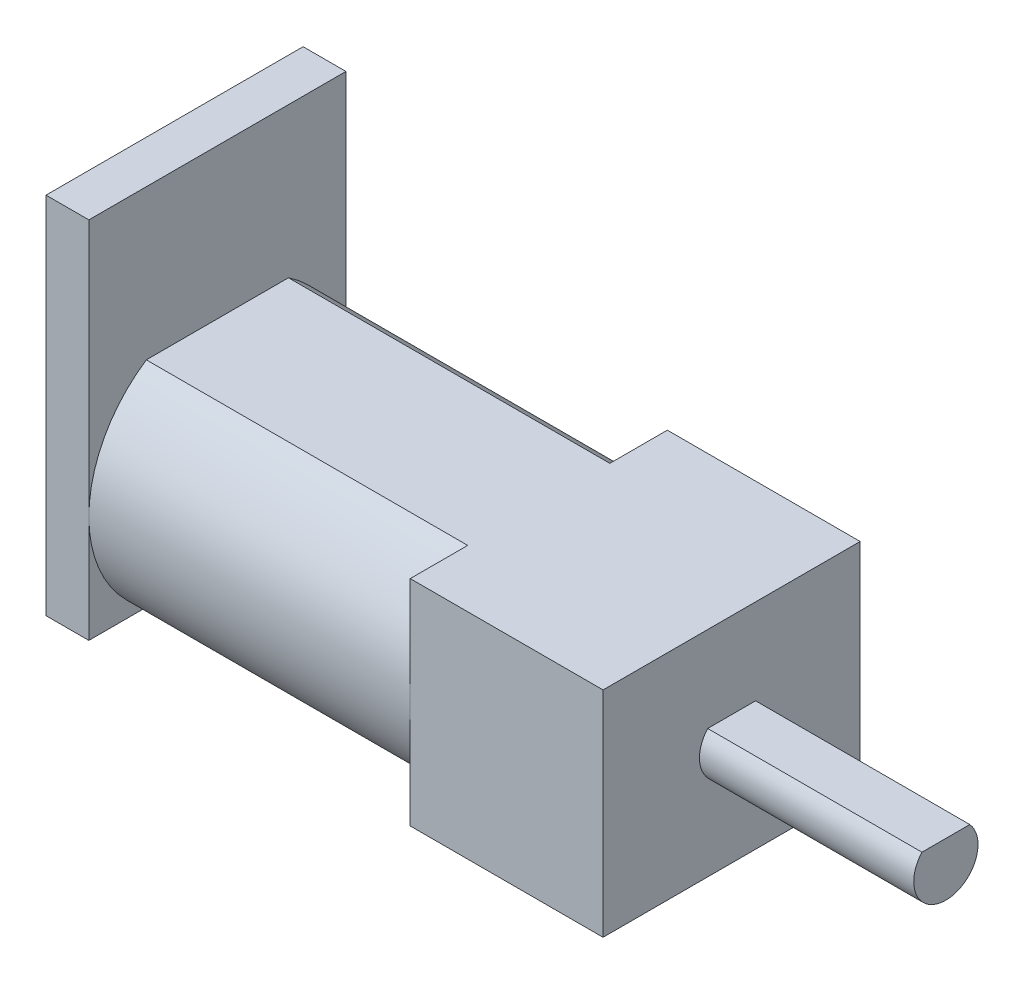
ISO-10303-21;
HEADER;
FILE_DESCRIPTION(('STEP AP214'),'2;1');
FILE_NAME('part.step','',(''),(''),'','','');
FILE_SCHEMA(('AUTOMOTIVE_DESIGN { 1 0 10303 214 1 1 1 1 }'));
ENDSEC;
DATA;
#1=APPLICATION_CONTEXT('core data for automotive mechanical design processes');
#2=APPLICATION_PROTOCOL_DEFINITION('international standard','automotive_design',2000,#1);
#3=PRODUCT_CONTEXT('',#1,'mechanical');
#4=PRODUCT('Part','Part','',(#3));
#5=PRODUCT_RELATED_PRODUCT_CATEGORY('part','',(#4));
#6=PRODUCT_DEFINITION_FORMATION('','',#4);
#7=PRODUCT_DEFINITION_CONTEXT('part definition',#1,'design');
#8=PRODUCT_DEFINITION('design','',#6,#7);
#9=PRODUCT_DEFINITION_SHAPE('','',#8);
#10=(LENGTH_UNIT() NAMED_UNIT(*) SI_UNIT(.MILLI.,.METRE.));
#11=(NAMED_UNIT(*) PLANE_ANGLE_UNIT() SI_UNIT($,.RADIAN.));
#12=(NAMED_UNIT(*) SI_UNIT($,.STERADIAN.) SOLID_ANGLE_UNIT());
#13=UNCERTAINTY_MEASURE_WITH_UNIT(LENGTH_MEASURE(1.E-05),#10,'distance_accuracy_value','');
#14=(GEOMETRIC_REPRESENTATION_CONTEXT(3) GLOBAL_UNCERTAINTY_ASSIGNED_CONTEXT((#13)) GLOBAL_UNIT_ASSIGNED_CONTEXT((#10,
#11,#12)) REPRESENTATION_CONTEXT('',''));
#15=CARTESIAN_POINT('',(0.,0.,0.));
#16=DIRECTION('',(0.,0.,1.));
#17=DIRECTION('',(1.,0.,0.));
#18=AXIS2_PLACEMENT_3D('',#15,#16,#17);
#19=CARTESIAN_POINT('',(24.,0.,0.));
#20=DIRECTION('',(1.,0.,0.));
#21=DIRECTION('',(0.,0.,-1.));
#22=AXIS2_PLACEMENT_3D('',#19,#20,#21);
#23=PLANE('',#22);
#24=DIRECTION('',(0.,0.,-1.));
#25=VECTOR('',#24,1.);
#26=CARTESIAN_POINT('',(24.,10.,0.));
#27=LINE('',#26,#25);
#28=CARTESIAN_POINT('',(24.,10.,0.));
#29=VERTEX_POINT('',#28);
#30=CARTESIAN_POINT('',(24.,10.,-12.));
#31=VERTEX_POINT('',#30);
#32=EDGE_CURVE('E234',#29,#31,#27,.T.);
#33=ORIENTED_EDGE('',*,*,#32,.F.);
#34=DIRECTION('',(0.,1.,0.));
#35=VECTOR('',#34,1.);
#36=CARTESIAN_POINT('',(24.,0.,0.));
#37=LINE('',#36,#35);
#38=CARTESIAN_POINT('',(24.,0.,0.));
#39=VERTEX_POINT('',#38);
#40=EDGE_CURVE('E237',#39,#29,#37,.T.);
#41=ORIENTED_EDGE('',*,*,#40,.F.);
#42=DIRECTION('',(0.,0.,-1.));
#43=VECTOR('',#42,1.);
#44=CARTESIAN_POINT('',(24.,0.,0.));
#45=LINE('',#44,#43);
#46=CARTESIAN_POINT('',(24.,0.,-12.));
#47=VERTEX_POINT('',#46);
#48=EDGE_CURVE('E240',#39,#47,#45,.T.);
#49=ORIENTED_EDGE('',*,*,#48,.T.);
#50=DIRECTION('',(0.,1.,0.));
#51=VECTOR('',#50,1.);
#52=CARTESIAN_POINT('',(24.,0.,-12.));
#53=LINE('',#52,#51);
#54=EDGE_CURVE('E243',#47,#31,#53,.T.);
#55=ORIENTED_EDGE('',*,*,#54,.T.);
#56=EDGE_LOOP('',(#33,#41,#49,#55));
#57=FACE_BOUND('',#56,.T.);
#58=DIRECTION('',(0.,0.,1.));
#59=VECTOR('',#58,1.);
#60=CARTESIAN_POINT('',(24.,6.,0.));
#61=LINE('',#60,#59);
#62=CARTESIAN_POINT('',(24.,6.,-7.1180339887499));
#63=VERTEX_POINT('',#62);
#64=CARTESIAN_POINT('',(24.,6.,-4.88196601125011));
#65=VERTEX_POINT('',#64);
#66=EDGE_CURVE('E11',#63,#65,#61,.T.);
#67=ORIENTED_EDGE('',*,*,#66,.F.);
#68=CARTESIAN_POINT('',(24.,5.,-6.));
#69=DIRECTION('',(1.,0.,0.));
#70=DIRECTION('',(0.,0.,-1.));
#71=AXIS2_PLACEMENT_3D('',#68,#69,#70);
#72=CIRCLE('',#71,1.5);
#73=EDGE_CURVE('E51',#63,#65,#72,.F.);
#74=ORIENTED_EDGE('',*,*,#73,.T.);
#75=EDGE_LOOP('',(#67,#74));
#76=FACE_BOUND('',#75,.T.);
#77=ADVANCED_FACE('F43',(#57,#76),#23,.T.);
#78=CARTESIAN_POINT('',(-2.,0.,-12.));
#79=DIRECTION('',(0.,0.,-1.));
#80=DIRECTION('',(-1.,0.,0.));
#81=AXIS2_PLACEMENT_3D('',#78,#79,#80);
#82=PLANE('',#81);
#83=DIRECTION('',(0.,1.,0.));
#84=VECTOR('',#83,1.);
#85=CARTESIAN_POINT('',(0.,0.,-12.));
#86=LINE('',#85,#84);
#87=CARTESIAN_POINT('',(0.,5.,-12.));
#88=VERTEX_POINT('',#87);
#89=CARTESIAN_POINT('',(0.,17.,-12.));
#90=VERTEX_POINT('',#89);
#91=EDGE_CURVE('E252',#88,#90,#86,.T.);
#92=ORIENTED_EDGE('',*,*,#91,.F.);
#93=DIRECTION('',(0.,1.,0.));
#94=VECTOR('',#93,1.);
#95=CARTESIAN_POINT('',(0.,0.,-12.));
#96=LINE('',#95,#94);
#97=CARTESIAN_POINT('',(0.,0.,-12.));
#98=VERTEX_POINT('',#97);
#99=EDGE_CURVE('E177',#98,#88,#96,.T.);
#100=ORIENTED_EDGE('',*,*,#99,.F.);
#101=DIRECTION('',(1.,0.,0.));
#102=VECTOR('',#101,1.);
#103=CARTESIAN_POINT('',(-2.,0.,-12.));
#104=LINE('',#103,#102);
#105=CARTESIAN_POINT('',(-2.,0.,-12.));
#106=VERTEX_POINT('',#105);
#107=EDGE_CURVE('E280',#106,#98,#104,.T.);
#108=ORIENTED_EDGE('',*,*,#107,.F.);
#109=DIRECTION('',(0.,1.,0.));
#110=VECTOR('',#109,1.);
#111=CARTESIAN_POINT('',(-2.,0.,-12.));
#112=LINE('',#111,#110);
#113=CARTESIAN_POINT('',(-2.,17.,-12.));
#114=VERTEX_POINT('',#113);
#115=EDGE_CURVE('E256',#106,#114,#112,.T.);
#116=ORIENTED_EDGE('',*,*,#115,.T.);
#117=DIRECTION('',(1.,0.,0.));
#118=VECTOR('',#117,1.);
#119=CARTESIAN_POINT('',(-2.,17.,-12.));
#120=LINE('',#119,#118);
#121=EDGE_CURVE('E277',#114,#90,#120,.T.);
#122=ORIENTED_EDGE('',*,*,#121,.T.);
#123=EDGE_LOOP('',(#92,#100,#108,#116,#122));
#124=FACE_BOUND('',#123,.T.);
#125=ADVANCED_FACE('F284',(#124),#82,.T.);
#126=CARTESIAN_POINT('',(-2.,0.,0.));
#127=DIRECTION('',(0.,0.,-1.));
#128=DIRECTION('',(-1.,0.,0.));
#129=AXIS2_PLACEMENT_3D('',#126,#127,#128);
#130=PLANE('',#129);
#131=DIRECTION('',(0.,1.,0.));
#132=VECTOR('',#131,1.);
#133=CARTESIAN_POINT('',(0.,0.,0.));
#134=LINE('',#133,#132);
#135=CARTESIAN_POINT('',(0.,0.,0.));
#136=VERTEX_POINT('',#135);
#137=CARTESIAN_POINT('',(0.,5.,0.));
#138=VERTEX_POINT('',#137);
#139=EDGE_CURVE('E203',#136,#138,#134,.T.);
#140=ORIENTED_EDGE('',*,*,#139,.T.);
#141=DIRECTION('',(0.,1.,0.));
#142=VECTOR('',#141,1.);
#143=CARTESIAN_POINT('',(0.,0.,0.));
#144=LINE('',#143,#142);
#145=CARTESIAN_POINT('',(0.,17.,0.));
#146=VERTEX_POINT('',#145);
#147=EDGE_CURVE('E257',#138,#146,#144,.T.);
#148=ORIENTED_EDGE('',*,*,#147,.T.);
#149=DIRECTION('',(1.,0.,0.));
#150=VECTOR('',#149,1.);
#151=CARTESIAN_POINT('',(-2.,17.,0.));
#152=LINE('',#151,#150);
#153=CARTESIAN_POINT('',(-2.,17.,0.));
#154=VERTEX_POINT('',#153);
#155=EDGE_CURVE('E274',#154,#146,#152,.T.);
#156=ORIENTED_EDGE('',*,*,#155,.F.);
#157=DIRECTION('',(0.,1.,0.));
#158=VECTOR('',#157,1.);
#159=CARTESIAN_POINT('',(-2.,0.,0.));
#160=LINE('',#159,#158);
#161=CARTESIAN_POINT('',(-2.,0.,0.));
#162=VERTEX_POINT('',#161);
#163=EDGE_CURVE('E262',#162,#154,#160,.T.);
#164=ORIENTED_EDGE('',*,*,#163,.F.);
#165=DIRECTION('',(1.,0.,0.));
#166=VECTOR('',#165,1.);
#167=CARTESIAN_POINT('',(-2.,0.,0.));
#168=LINE('',#167,#166);
#169=EDGE_CURVE('E270',#162,#136,#168,.T.);
#170=ORIENTED_EDGE('',*,*,#169,.T.);
#171=EDGE_LOOP('',(#140,#148,#156,#164,#170));
#172=FACE_BOUND('',#171,.T.);
#173=ADVANCED_FACE('F292',(#172),#130,.F.);
#174=CARTESIAN_POINT('',(0.,0.,0.));
#175=DIRECTION('',(1.,0.,0.));
#176=DIRECTION('',(0.,0.,-1.));
#177=AXIS2_PLACEMENT_3D('',#174,#175,#176);
#178=PLANE('',#177);
#179=ORIENTED_EDGE('',*,*,#147,.F.);
#180=CARTESIAN_POINT('',(0.,5.,-6.));
#181=DIRECTION('',(1.,0.,0.));
#182=DIRECTION('',(0.,0.,-1.));
#183=AXIS2_PLACEMENT_3D('',#180,#181,#182);
#184=CIRCLE('',#183,6.);
#185=CARTESIAN_POINT('',(0.,10.,-2.6833752096446));
#186=VERTEX_POINT('',#185);
#187=EDGE_CURVE('E65',#186,#138,#184,.T.);
#188=ORIENTED_EDGE('',*,*,#187,.F.);
#189=DIRECTION('',(0.,0.,-1.));
#190=VECTOR('',#189,1.);
#191=CARTESIAN_POINT('',(0.,10.,0.));
#192=LINE('',#191,#190);
#193=CARTESIAN_POINT('',(0.,10.,-9.31662479035541));
#194=VERTEX_POINT('',#193);
#195=EDGE_CURVE('E223',#186,#194,#192,.T.);
#196=ORIENTED_EDGE('',*,*,#195,.T.);
#197=CARTESIAN_POINT('',(0.,5.,-6.));
#198=DIRECTION('',(1.,0.,0.));
#199=DIRECTION('',(0.,0.,-1.));
#200=AXIS2_PLACEMENT_3D('',#197,#198,#199);
#201=CIRCLE('',#200,6.);
#202=EDGE_CURVE('E213',#88,#194,#201,.T.);
#203=ORIENTED_EDGE('',*,*,#202,.F.);
#204=ORIENTED_EDGE('',*,*,#91,.T.);
#205=DIRECTION('',(0.,0.,-1.));
#206=VECTOR('',#205,1.);
#207=CARTESIAN_POINT('',(0.,17.,0.));
#208=LINE('',#207,#206);
#209=EDGE_CURVE('E266',#146,#90,#208,.T.);
#210=ORIENTED_EDGE('',*,*,#209,.F.);
#211=EDGE_LOOP('',(#179,#188,#196,#203,#204,#210));
#212=FACE_BOUND('',#211,.T.);
#213=ADVANCED_FACE('F308',(#212),#178,.T.);
#214=CARTESIAN_POINT('',(-2.,0.,0.));
#215=DIRECTION('',(0.,-1.,0.));
#216=DIRECTION('',(0.,0.,-1.));
#217=AXIS2_PLACEMENT_3D('',#214,#215,#216);
#218=PLANE('',#217);
#219=DIRECTION('',(0.,0.,-1.));
#220=VECTOR('',#219,1.);
#221=CARTESIAN_POINT('',(15.,0.,0.));
#222=LINE('',#221,#220);
#223=CARTESIAN_POINT('',(15.,0.,-9.3166247903554));
#224=VERTEX_POINT('',#223);
#225=CARTESIAN_POINT('',(15.,0.,-12.));
#226=VERTEX_POINT('',#225);
#227=EDGE_CURVE('E176',#224,#226,#222,.T.);
#228=ORIENTED_EDGE('',*,*,#227,.T.);
#229=EDGE_CURVE('E264',#226,#47,#104,.T.);
#230=ORIENTED_EDGE('',*,*,#229,.T.);
#231=ORIENTED_EDGE('',*,*,#48,.F.);
#232=CARTESIAN_POINT('',(15.,0.,0.));
#233=VERTEX_POINT('',#232);
#234=EDGE_CURVE('E273',#233,#39,#168,.T.);
#235=ORIENTED_EDGE('',*,*,#234,.F.);
#236=DIRECTION('',(0.,0.,-1.));
#237=VECTOR('',#236,1.);
#238=CARTESIAN_POINT('',(15.,0.,0.));
#239=LINE('',#238,#237);
#240=CARTESIAN_POINT('',(15.,0.,-2.68337520964461));
#241=VERTEX_POINT('',#240);
#242=EDGE_CURVE('E197',#233,#241,#239,.T.);
#243=ORIENTED_EDGE('',*,*,#242,.T.);
#244=DIRECTION('',(-1.,0.,0.));
#245=VECTOR('',#244,1.);
#246=CARTESIAN_POINT('',(15.,0.,-2.68337520964461));
#247=LINE('',#246,#245);
#248=CARTESIAN_POINT('',(0.,0.,-2.68337520964461));
#249=VERTEX_POINT('',#248);
#250=EDGE_CURVE('E200',#241,#249,#247,.T.);
#251=ORIENTED_EDGE('',*,*,#250,.T.);
#252=DIRECTION('',(0.,0.,-1.));
#253=VECTOR('',#252,1.);
#254=CARTESIAN_POINT('',(0.,0.,0.));
#255=LINE('',#254,#253);
#256=EDGE_CURVE('E195',#136,#249,#255,.T.);
#257=ORIENTED_EDGE('',*,*,#256,.F.);
#258=ORIENTED_EDGE('',*,*,#169,.F.);
#259=DIRECTION('',(0.,0.,-1.));
#260=VECTOR('',#259,1.);
#261=CARTESIAN_POINT('',(-2.,0.,0.));
#262=LINE('',#261,#260);
#263=EDGE_CURVE('E253',#162,#106,#262,.T.);
#264=ORIENTED_EDGE('',*,*,#263,.T.);
#265=ORIENTED_EDGE('',*,*,#107,.T.);
#266=DIRECTION('',(0.,0.,-1.));
#267=VECTOR('',#266,1.);
#268=CARTESIAN_POINT('',(0.,0.,0.));
#269=LINE('',#268,#267);
#270=CARTESIAN_POINT('',(0.,0.,-9.3166247903554));
#271=VERTEX_POINT('',#270);
#272=EDGE_CURVE('E185',#271,#98,#269,.T.);
#273=ORIENTED_EDGE('',*,*,#272,.F.);
#274=DIRECTION('',(-1.,0.,0.));
#275=VECTOR('',#274,1.);
#276=CARTESIAN_POINT('',(15.,0.,-9.3166247903554));
#277=LINE('',#276,#275);
#278=EDGE_CURVE('E183',#224,#271,#277,.T.);
#279=ORIENTED_EDGE('',*,*,#278,.F.);
#280=EDGE_LOOP('',(#228,#230,#231,#235,#243,#251,#257,#258,#264,#265,#273,#279));
#281=FACE_BOUND('',#280,.T.);
#282=ADVANCED_FACE('F45',(#281),#218,.T.);
#283=DIRECTION('',(0.,1.,0.));
#284=VECTOR('',#283,1.);
#285=CARTESIAN_POINT('',(15.,0.,0.));
#286=LINE('',#285,#284);
#287=CARTESIAN_POINT('',(15.,5.,0.));
#288=VERTEX_POINT('',#287);
#289=CARTESIAN_POINT('',(15.,10.,0.));
#290=VERTEX_POINT('',#289);
#291=EDGE_CURVE('E230',#288,#290,#286,.T.);
#292=ORIENTED_EDGE('',*,*,#291,.F.);
#293=DIRECTION('',(0.,1.,0.));
#294=VECTOR('',#293,1.);
#295=CARTESIAN_POINT('',(15.,0.,0.));
#296=LINE('',#295,#294);
#297=EDGE_CURVE('E194',#233,#288,#296,.T.);
#298=ORIENTED_EDGE('',*,*,#297,.F.);
#299=ORIENTED_EDGE('',*,*,#234,.T.);
#300=ORIENTED_EDGE('',*,*,#40,.T.);
#301=DIRECTION('',(-1.,0.,0.));
#302=VECTOR('',#301,1.);
#303=CARTESIAN_POINT('',(24.,10.,0.));
#304=LINE('',#303,#302);
#305=EDGE_CURVE('E249',#29,#290,#304,.T.);
#306=ORIENTED_EDGE('',*,*,#305,.T.);
#307=EDGE_LOOP('',(#292,#298,#299,#300,#306));
#308=FACE_BOUND('',#307,.T.);
#309=ADVANCED_FACE('F311',(#308),#130,.F.);
#310=CARTESIAN_POINT('',(-2.,17.,0.));
#311=DIRECTION('',(0.,-1.,0.));
#312=DIRECTION('',(0.,0.,-1.));
#313=AXIS2_PLACEMENT_3D('',#310,#311,#312);
#314=PLANE('',#313);
#315=ORIENTED_EDGE('',*,*,#209,.T.);
#316=ORIENTED_EDGE('',*,*,#121,.F.);
#317=DIRECTION('',(0.,0.,-1.));
#318=VECTOR('',#317,1.);
#319=CARTESIAN_POINT('',(-2.,17.,0.));
#320=LINE('',#319,#318);
#321=EDGE_CURVE('E260',#154,#114,#320,.T.);
#322=ORIENTED_EDGE('',*,*,#321,.F.);
#323=ORIENTED_EDGE('',*,*,#155,.T.);
#324=EDGE_LOOP('',(#315,#316,#322,#323));
#325=FACE_BOUND('',#324,.T.);
#326=ADVANCED_FACE('F314',(#325),#314,.F.);
#327=DIRECTION('',(0.,1.,0.));
#328=VECTOR('',#327,1.);
#329=CARTESIAN_POINT('',(15.,0.,-12.));
#330=LINE('',#329,#328);
#331=CARTESIAN_POINT('',(15.,5.,-12.));
#332=VERTEX_POINT('',#331);
#333=EDGE_CURVE('E180',#226,#332,#330,.T.);
#334=ORIENTED_EDGE('',*,*,#333,.T.);
#335=DIRECTION('',(0.,1.,0.));
#336=VECTOR('',#335,1.);
#337=CARTESIAN_POINT('',(15.,0.,-12.));
#338=LINE('',#337,#336);
#339=CARTESIAN_POINT('',(15.,10.,-12.));
#340=VERTEX_POINT('',#339);
#341=EDGE_CURVE('E212',#332,#340,#338,.T.);
#342=ORIENTED_EDGE('',*,*,#341,.T.);
#343=DIRECTION('',(-1.,0.,0.));
#344=VECTOR('',#343,1.);
#345=CARTESIAN_POINT('',(24.,10.,-12.));
#346=LINE('',#345,#344);
#347=EDGE_CURVE('E245',#31,#340,#346,.T.);
#348=ORIENTED_EDGE('',*,*,#347,.F.);
#349=ORIENTED_EDGE('',*,*,#54,.F.);
#350=ORIENTED_EDGE('',*,*,#229,.F.);
#351=EDGE_LOOP('',(#334,#342,#348,#349,#350));
#352=FACE_BOUND('',#351,.T.);
#353=ADVANCED_FACE('F294',(#352),#82,.T.);
#354=CARTESIAN_POINT('',(-2.,0.,0.));
#355=DIRECTION('',(1.,0.,0.));
#356=DIRECTION('',(0.,0.,-1.));
#357=AXIS2_PLACEMENT_3D('',#354,#355,#356);
#358=PLANE('',#357);
#359=ORIENTED_EDGE('',*,*,#263,.F.);
#360=ORIENTED_EDGE('',*,*,#163,.T.);
#361=ORIENTED_EDGE('',*,*,#321,.T.);
#362=ORIENTED_EDGE('',*,*,#115,.F.);
#363=EDGE_LOOP('',(#359,#360,#361,#362));
#364=FACE_BOUND('',#363,.T.);
#365=ADVANCED_FACE('F303',(#364),#358,.F.);
#366=CARTESIAN_POINT('',(24.,10.,0.));
#367=DIRECTION('',(0.,1.,0.));
#368=DIRECTION('',(0.,0.,1.));
#369=AXIS2_PLACEMENT_3D('',#366,#367,#368);
#370=PLANE('',#369);
#371=DIRECTION('',(-1.,0.,0.));
#372=VECTOR('',#371,1.);
#373=CARTESIAN_POINT('',(15.,10.,-9.31662479035541));
#374=LINE('',#373,#372);
#375=CARTESIAN_POINT('',(15.,10.,-9.31662479035541));
#376=VERTEX_POINT('',#375);
#377=EDGE_CURVE('E218',#376,#194,#374,.T.);
#378=ORIENTED_EDGE('',*,*,#377,.T.);
#379=ORIENTED_EDGE('',*,*,#195,.F.);
#380=DIRECTION('',(-1.,0.,0.));
#381=VECTOR('',#380,1.);
#382=CARTESIAN_POINT('',(15.,10.,-2.6833752096446));
#383=LINE('',#382,#381);
#384=CARTESIAN_POINT('',(15.,10.,-2.6833752096446));
#385=VERTEX_POINT('',#384);
#386=EDGE_CURVE('E220',#385,#186,#383,.T.);
#387=ORIENTED_EDGE('',*,*,#386,.F.);
#388=DIRECTION('',(0.,0.,-1.));
#389=VECTOR('',#388,1.);
#390=CARTESIAN_POINT('',(15.,10.,0.));
#391=LINE('',#390,#389);
#392=EDGE_CURVE('E227',#290,#385,#391,.T.);
#393=ORIENTED_EDGE('',*,*,#392,.F.);
#394=ORIENTED_EDGE('',*,*,#305,.F.);
#395=ORIENTED_EDGE('',*,*,#32,.T.);
#396=ORIENTED_EDGE('',*,*,#347,.T.);
#397=DIRECTION('',(0.,0.,-1.));
#398=VECTOR('',#397,1.);
#399=CARTESIAN_POINT('',(15.,10.,0.));
#400=LINE('',#399,#398);
#401=EDGE_CURVE('E216',#376,#340,#400,.T.);
#402=ORIENTED_EDGE('',*,*,#401,.F.);
#403=EDGE_LOOP('',(#378,#379,#387,#393,#394,#395,#396,#402));
#404=FACE_BOUND('',#403,.T.);
#405=ADVANCED_FACE('F300',(#404),#370,.T.);
#406=CARTESIAN_POINT('',(15.,5.,-6.));
#407=DIRECTION('',(-1.,0.,0.));
#408=DIRECTION('',(0.,0.,1.));
#409=AXIS2_PLACEMENT_3D('',#406,#407,#408);
#410=CYLINDRICAL_SURFACE('',#409,6.);
#411=ORIENTED_EDGE('',*,*,#187,.T.);
#412=CARTESIAN_POINT('',(0.,5.,-6.));
#413=DIRECTION('',(1.,0.,0.));
#414=DIRECTION('',(0.,0.,-1.));
#415=AXIS2_PLACEMENT_3D('',#412,#413,#414);
#416=CIRCLE('',#415,6.);
#417=EDGE_CURVE('E190',#138,#249,#416,.T.);
#418=ORIENTED_EDGE('',*,*,#417,.T.);
#419=ORIENTED_EDGE('',*,*,#250,.F.);
#420=CARTESIAN_POINT('',(15.,5.,-6.));
#421=DIRECTION('',(1.,0.,0.));
#422=DIRECTION('',(0.,0.,-1.));
#423=AXIS2_PLACEMENT_3D('',#420,#421,#422);
#424=CIRCLE('',#423,6.);
#425=EDGE_CURVE('E191',#288,#241,#424,.T.);
#426=ORIENTED_EDGE('',*,*,#425,.F.);
#427=CARTESIAN_POINT('',(15.,5.,-6.));
#428=DIRECTION('',(1.,0.,0.));
#429=DIRECTION('',(0.,0.,-1.));
#430=AXIS2_PLACEMENT_3D('',#427,#428,#429);
#431=CIRCLE('',#430,6.);
#432=EDGE_CURVE('E224',#385,#288,#431,.T.);
#433=ORIENTED_EDGE('',*,*,#432,.F.);
#434=ORIENTED_EDGE('',*,*,#386,.T.);
#435=EDGE_LOOP('',(#411,#418,#419,#426,#433,#434));
#436=FACE_BOUND('',#435,.T.);
#437=ADVANCED_FACE('F298',(#436),#410,.T.);
#438=CARTESIAN_POINT('',(15.,0.,0.));
#439=DIRECTION('',(1.,0.,0.));
#440=DIRECTION('',(0.,0.,-1.));
#441=AXIS2_PLACEMENT_3D('',#438,#439,#440);
#442=PLANE('',#441);
#443=ORIENTED_EDGE('',*,*,#432,.T.);
#444=ORIENTED_EDGE('',*,*,#291,.T.);
#445=ORIENTED_EDGE('',*,*,#392,.T.);
#446=EDGE_LOOP('',(#443,#444,#445));
#447=FACE_BOUND('',#446,.T.);
#448=ADVANCED_FACE('F385',(#447),#442,.F.);
#449=CARTESIAN_POINT('',(15.,5.,-6.));
#450=DIRECTION('',(-1.,0.,0.));
#451=DIRECTION('',(0.,0.,1.));
#452=AXIS2_PLACEMENT_3D('',#449,#450,#451);
#453=CYLINDRICAL_SURFACE('',#452,6.);
#454=ORIENTED_EDGE('',*,*,#202,.T.);
#455=ORIENTED_EDGE('',*,*,#377,.F.);
#456=CARTESIAN_POINT('',(15.,5.,-6.));
#457=DIRECTION('',(1.,0.,0.));
#458=DIRECTION('',(0.,0.,-1.));
#459=AXIS2_PLACEMENT_3D('',#456,#457,#458);
#460=CIRCLE('',#459,6.);
#461=EDGE_CURVE('E209',#332,#376,#460,.T.);
#462=ORIENTED_EDGE('',*,*,#461,.F.);
#463=CARTESIAN_POINT('',(15.,5.,-6.));
#464=DIRECTION('',(1.,0.,0.));
#465=DIRECTION('',(0.,0.,-1.));
#466=AXIS2_PLACEMENT_3D('',#463,#464,#465);
#467=CIRCLE('',#466,6.);
#468=EDGE_CURVE('E174',#224,#332,#467,.T.);
#469=ORIENTED_EDGE('',*,*,#468,.F.);
#470=ORIENTED_EDGE('',*,*,#278,.T.);
#471=CARTESIAN_POINT('',(0.,5.,-6.));
#472=DIRECTION('',(1.,0.,0.));
#473=DIRECTION('',(0.,0.,-1.));
#474=AXIS2_PLACEMENT_3D('',#471,#472,#473);
#475=CIRCLE('',#474,6.);
#476=EDGE_CURVE('E162',#271,#88,#475,.T.);
#477=ORIENTED_EDGE('',*,*,#476,.T.);
#478=EDGE_LOOP('',(#454,#455,#462,#469,#470,#477));
#479=FACE_BOUND('',#478,.T.);
#480=ADVANCED_FACE('F335',(#479),#453,.T.);
#481=CARTESIAN_POINT('',(15.,0.,0.));
#482=DIRECTION('',(1.,0.,0.));
#483=DIRECTION('',(0.,0.,-1.));
#484=AXIS2_PLACEMENT_3D('',#481,#482,#483);
#485=PLANE('',#484);
#486=ORIENTED_EDGE('',*,*,#461,.T.);
#487=ORIENTED_EDGE('',*,*,#401,.T.);
#488=ORIENTED_EDGE('',*,*,#341,.F.);
#489=EDGE_LOOP('',(#486,#487,#488));
#490=FACE_BOUND('',#489,.T.);
#491=ADVANCED_FACE('F331',(#490),#485,.F.);
#492=CARTESIAN_POINT('',(15.,0.,0.));
#493=DIRECTION('',(1.,0.,0.));
#494=DIRECTION('',(0.,0.,-1.));
#495=AXIS2_PLACEMENT_3D('',#492,#493,#494);
#496=PLANE('',#495);
#497=ORIENTED_EDGE('',*,*,#425,.T.);
#498=ORIENTED_EDGE('',*,*,#242,.F.);
#499=ORIENTED_EDGE('',*,*,#297,.T.);
#500=EDGE_LOOP('',(#497,#498,#499));
#501=FACE_BOUND('',#500,.T.);
#502=ADVANCED_FACE('F373',(#501),#496,.F.);
#503=CARTESIAN_POINT('',(0.,0.,0.));
#504=DIRECTION('',(1.,0.,0.));
#505=DIRECTION('',(0.,0.,-1.));
#506=AXIS2_PLACEMENT_3D('',#503,#504,#505);
#507=PLANE('',#506);
#508=ORIENTED_EDGE('',*,*,#417,.F.);
#509=ORIENTED_EDGE('',*,*,#139,.F.);
#510=ORIENTED_EDGE('',*,*,#256,.T.);
#511=EDGE_LOOP('',(#508,#509,#510));
#512=FACE_BOUND('',#511,.T.);
#513=ADVANCED_FACE('F364',(#512),#507,.T.);
#514=CARTESIAN_POINT('',(15.,0.,0.));
#515=DIRECTION('',(1.,0.,0.));
#516=DIRECTION('',(0.,0.,-1.));
#517=AXIS2_PLACEMENT_3D('',#514,#515,#516);
#518=PLANE('',#517);
#519=ORIENTED_EDGE('',*,*,#468,.T.);
#520=ORIENTED_EDGE('',*,*,#333,.F.);
#521=ORIENTED_EDGE('',*,*,#227,.F.);
#522=EDGE_LOOP('',(#519,#520,#521));
#523=FACE_BOUND('',#522,.T.);
#524=ADVANCED_FACE('F361',(#523),#518,.F.);
#525=CARTESIAN_POINT('',(0.,0.,0.));
#526=DIRECTION('',(1.,0.,0.));
#527=DIRECTION('',(0.,0.,-1.));
#528=AXIS2_PLACEMENT_3D('',#525,#526,#527);
#529=PLANE('',#528);
#530=ORIENTED_EDGE('',*,*,#476,.F.);
#531=ORIENTED_EDGE('',*,*,#272,.T.);
#532=ORIENTED_EDGE('',*,*,#99,.T.);
#533=EDGE_LOOP('',(#530,#531,#532));
#534=FACE_BOUND('',#533,.T.);
#535=ADVANCED_FACE('F363',(#534),#529,.T.);
#536=CARTESIAN_POINT('',(34.,6.,0.));
#537=DIRECTION('',(0.,1.,0.));
#538=DIRECTION('',(0.,0.,1.));
#539=AXIS2_PLACEMENT_3D('',#536,#537,#538);
#540=PLANE('',#539);
#541=DIRECTION('',(-1.,0.,0.));
#542=VECTOR('',#541,1.);
#543=CARTESIAN_POINT('',(34.,6.,-7.1180339887499));
#544=LINE('',#543,#542);
#545=CARTESIAN_POINT('',(34.,6.,-7.1180339887499));
#546=VERTEX_POINT('',#545);
#547=EDGE_CURVE('E163',#546,#63,#544,.T.);
#548=ORIENTED_EDGE('',*,*,#547,.T.);
#549=ORIENTED_EDGE('',*,*,#66,.T.);
#550=DIRECTION('',(-1.,0.,0.));
#551=VECTOR('',#550,1.);
#552=CARTESIAN_POINT('',(34.,6.,-4.88196601125011));
#553=LINE('',#552,#551);
#554=CARTESIAN_POINT('',(34.,6.,-4.88196601125011));
#555=VERTEX_POINT('',#554);
#556=EDGE_CURVE('E58',#555,#65,#553,.T.);
#557=ORIENTED_EDGE('',*,*,#556,.F.);
#558=DIRECTION('',(0.,0.,-1.));
#559=VECTOR('',#558,1.);
#560=CARTESIAN_POINT('',(34.,6.,0.));
#561=LINE('',#560,#559);
#562=EDGE_CURVE('E159',#555,#546,#561,.T.);
#563=ORIENTED_EDGE('',*,*,#562,.T.);
#564=EDGE_LOOP('',(#548,#549,#557,#563));
#565=FACE_BOUND('',#564,.T.);
#566=ADVANCED_FACE('F157',(#565),#540,.T.);
#567=CARTESIAN_POINT('',(34.,5.,-6.));
#568=DIRECTION('',(-1.,0.,0.));
#569=DIRECTION('',(0.,0.,1.));
#570=AXIS2_PLACEMENT_3D('',#567,#568,#569);
#571=CYLINDRICAL_SURFACE('',#570,1.5);
#572=ORIENTED_EDGE('',*,*,#73,.F.);
#573=ORIENTED_EDGE('',*,*,#547,.F.);
#574=CARTESIAN_POINT('',(34.,5.,-6.));
#575=DIRECTION('',(1.,0.,0.));
#576=DIRECTION('',(0.,0.,-1.));
#577=AXIS2_PLACEMENT_3D('',#574,#575,#576);
#578=CIRCLE('',#577,1.5);
#579=EDGE_CURVE('E166',#555,#546,#578,.T.);
#580=ORIENTED_EDGE('',*,*,#579,.F.);
#581=ORIENTED_EDGE('',*,*,#556,.T.);
#582=EDGE_LOOP('',(#572,#573,#580,#581));
#583=FACE_BOUND('',#582,.T.);
#584=ADVANCED_FACE('F167',(#583),#571,.T.);
#585=CARTESIAN_POINT('',(34.,0.,0.));
#586=DIRECTION('',(1.,0.,0.));
#587=DIRECTION('',(0.,0.,-1.));
#588=AXIS2_PLACEMENT_3D('',#585,#586,#587);
#589=PLANE('',#588);
#590=ORIENTED_EDGE('',*,*,#562,.F.);
#591=ORIENTED_EDGE('',*,*,#579,.T.);
#592=EDGE_LOOP('',(#590,#591));
#593=FACE_BOUND('',#592,.T.);
#594=ADVANCED_FACE('F170',(#593),#589,.T.);
#595=CLOSED_SHELL('',(#77,#125,#173,#213,#282,#309,#326,#353,#365,#405,#437,#448,#480,#491,#502,
#513,#524,#535,#566,#584,#594));
#596=MANIFOLD_SOLID_BREP('B2',#595);
#597=ADVANCED_BREP_SHAPE_REPRESENTATION('',(#18,#596),#14);
#598=SHAPE_DEFINITION_REPRESENTATION(#9,#597);
ENDSEC;
END-ISO-10303-21;
